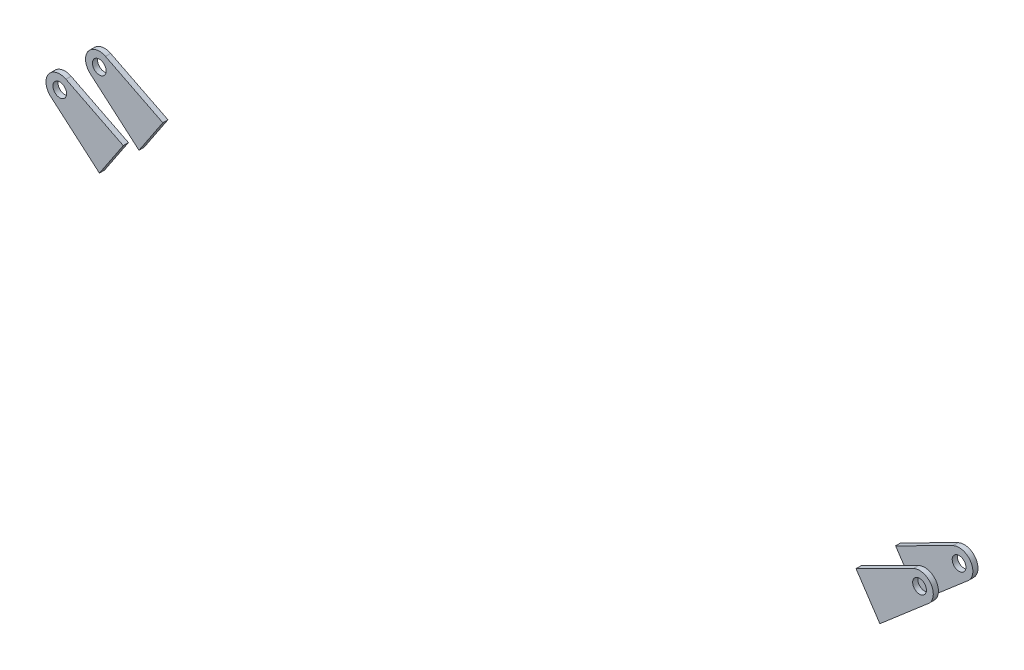
ISO-10303-21;
HEADER;
FILE_DESCRIPTION(('STEP AP214'),'2;1');
FILE_NAME('part.step','',(''),(''),'','','');
FILE_SCHEMA(('AUTOMOTIVE_DESIGN { 1 0 10303 214 1 1 1 1 }'));
ENDSEC;
DATA;
#1=APPLICATION_CONTEXT('core data for automotive mechanical design processes');
#2=APPLICATION_PROTOCOL_DEFINITION('international standard','automotive_design',2000,#1);
#3=PRODUCT_CONTEXT('',#1,'mechanical');
#4=PRODUCT('Part','Part','',(#3));
#5=PRODUCT_RELATED_PRODUCT_CATEGORY('part','',(#4));
#6=PRODUCT_DEFINITION_FORMATION('','',#4);
#7=PRODUCT_DEFINITION_CONTEXT('part definition',#1,'design');
#8=PRODUCT_DEFINITION('design','',#6,#7);
#9=PRODUCT_DEFINITION_SHAPE('','',#8);
#10=(LENGTH_UNIT() NAMED_UNIT(*) SI_UNIT(.MILLI.,.METRE.));
#11=(NAMED_UNIT(*) PLANE_ANGLE_UNIT() SI_UNIT($,.RADIAN.));
#12=(NAMED_UNIT(*) SI_UNIT($,.STERADIAN.) SOLID_ANGLE_UNIT());
#13=UNCERTAINTY_MEASURE_WITH_UNIT(LENGTH_MEASURE(1.E-05),#10,'distance_accuracy_value','');
#14=(GEOMETRIC_REPRESENTATION_CONTEXT(3) GLOBAL_UNCERTAINTY_ASSIGNED_CONTEXT((#13)) GLOBAL_UNIT_ASSIGNED_CONTEXT((#10,
#11,#12)) REPRESENTATION_CONTEXT('',''));
#15=CARTESIAN_POINT('',(0.,0.,0.));
#16=DIRECTION('',(0.,0.,1.));
#17=DIRECTION('',(1.,0.,0.));
#18=AXIS2_PLACEMENT_3D('',#15,#16,#17);
#19=CARTESIAN_POINT('',(0.,0.,119.000000000009));
#20=DIRECTION('',(0.,0.,1.));
#21=DIRECTION('',(1.,0.,0.));
#22=AXIS2_PLACEMENT_3D('',#19,#20,#21);
#23=PLANE('',#22);
#24=CARTESIAN_POINT('',(-250.,-2230.,119.000000000009));
#25=DIRECTION('',(0.,0.,-1.));
#26=DIRECTION('',(-1.,0.,0.));
#27=AXIS2_PLACEMENT_3D('',#24,#25,#26);
#28=CIRCLE('',#27,3.99999999999999);
#29=CARTESIAN_POINT('',(-254.,-2230.,119.000000000009));
#30=VERTEX_POINT('',#29);
#31=EDGE_CURVE('E159',#30,#30,#28,.T.);
#32=ORIENTED_EDGE('',*,*,#31,.F.);
#33=EDGE_LOOP('',(#32));
#34=FACE_BOUND('',#33,.T.);
#35=DIRECTION('',(0.758024269751169,-0.65222634603963,0.));
#36=VECTOR('',#35,1.);
#37=CARTESIAN_POINT('',(-255.217810768318,-2236.06419415801,119.000000000009));
#38=LINE('',#37,#36);
#39=CARTESIAN_POINT('',(-255.217810768317,-2236.06419415801,119.000000000009));
#40=VERTEX_POINT('',#39);
#41=CARTESIAN_POINT('',(-226.933752452818,-2260.40062867922,119.000000000009));
#42=VERTEX_POINT('',#41);
#43=EDGE_CURVE('E157',#40,#42,#38,.T.);
#44=ORIENTED_EDGE('',*,*,#43,.F.);
#45=CARTESIAN_POINT('',(-250.,-2230.,119.000000000009));
#46=DIRECTION('',(0.,0.,-1.));
#47=DIRECTION('',(-1.,0.,0.));
#48=AXIS2_PLACEMENT_3D('',#45,#46,#47);
#49=CIRCLE('',#48,8.0000000000008);
#50=CARTESIAN_POINT('',(-246.409132611189,-2222.85117692232,119.000000000009));
#51=VERTEX_POINT('',#50);
#52=EDGE_CURVE('E146',#40,#51,#49,.T.);
#53=ORIENTED_EDGE('',*,*,#52,.T.);
#54=DIRECTION('',(-0.893602884710091,0.448858423601255,0.));
#55=VECTOR('',#54,1.);
#56=CARTESIAN_POINT('',(-213.066247547185,-2239.59937132078,119.000000000009));
#57=LINE('',#56,#55);
#58=CARTESIAN_POINT('',(-213.066247547185,-2239.59937132078,119.000000000009));
#59=VERTEX_POINT('',#58);
#60=EDGE_CURVE('E138',#59,#51,#57,.T.);
#61=ORIENTED_EDGE('',*,*,#60,.F.);
#62=DIRECTION('',(0.554700196225245,0.832050294337833,0.));
#63=VECTOR('',#62,1.);
#64=CARTESIAN_POINT('',(-226.933752452818,-2260.40062867922,119.000000000009));
#65=LINE('',#64,#63);
#66=EDGE_CURVE('E95',#42,#59,#65,.T.);
#67=ORIENTED_EDGE('',*,*,#66,.F.);
#68=EDGE_LOOP('',(#44,#53,#61,#67));
#69=FACE_BOUND('',#68,.T.);
#70=ADVANCED_FACE('F86',(#34,#69),#23,.F.);
#71=CARTESIAN_POINT('',(0.,0.,122.000000000009));
#72=DIRECTION('',(0.,0.,1.));
#73=DIRECTION('',(1.,0.,0.));
#74=AXIS2_PLACEMENT_3D('',#71,#72,#73);
#75=PLANE('',#74);
#76=CARTESIAN_POINT('',(-250.,-2230.,122.000000000009));
#77=DIRECTION('',(0.,0.,-1.));
#78=DIRECTION('',(-1.,0.,0.));
#79=AXIS2_PLACEMENT_3D('',#76,#77,#78);
#80=CIRCLE('',#79,3.99999999999999);
#81=CARTESIAN_POINT('',(-254.,-2230.,122.000000000009));
#82=VERTEX_POINT('',#81);
#83=EDGE_CURVE('E185',#82,#82,#80,.T.);
#84=ORIENTED_EDGE('',*,*,#83,.T.);
#85=EDGE_LOOP('',(#84));
#86=FACE_BOUND('',#85,.T.);
#87=DIRECTION('',(0.758024269751169,-0.65222634603963,0.));
#88=VECTOR('',#87,1.);
#89=CARTESIAN_POINT('',(-255.217810768318,-2236.06419415801,122.000000000009));
#90=LINE('',#89,#88);
#91=CARTESIAN_POINT('',(-255.217810768317,-2236.06419415801,122.000000000009));
#92=VERTEX_POINT('',#91);
#93=CARTESIAN_POINT('',(-226.933752452818,-2260.40062867922,122.000000000009));
#94=VERTEX_POINT('',#93);
#95=EDGE_CURVE('E173',#92,#94,#90,.T.);
#96=ORIENTED_EDGE('',*,*,#95,.T.);
#97=DIRECTION('',(0.554700196225245,0.832050294337833,0.));
#98=VECTOR('',#97,1.);
#99=CARTESIAN_POINT('',(-226.933752452818,-2260.40062867922,122.000000000009));
#100=LINE('',#99,#98);
#101=CARTESIAN_POINT('',(-213.066247547185,-2239.59937132078,122.000000000009));
#102=VERTEX_POINT('',#101);
#103=EDGE_CURVE('E13',#94,#102,#100,.T.);
#104=ORIENTED_EDGE('',*,*,#103,.T.);
#105=DIRECTION('',(-0.893602884710091,0.448858423601255,0.));
#106=VECTOR('',#105,1.);
#107=CARTESIAN_POINT('',(-213.066247547185,-2239.59937132078,122.000000000009));
#108=LINE('',#107,#106);
#109=CARTESIAN_POINT('',(-246.409132611189,-2222.85117692232,122.000000000009));
#110=VERTEX_POINT('',#109);
#111=EDGE_CURVE('E136',#102,#110,#108,.T.);
#112=ORIENTED_EDGE('',*,*,#111,.T.);
#113=CARTESIAN_POINT('',(-250.,-2230.,122.000000000009));
#114=DIRECTION('',(0.,0.,-1.));
#115=DIRECTION('',(-1.,0.,0.));
#116=AXIS2_PLACEMENT_3D('',#113,#114,#115);
#117=CIRCLE('',#116,8.0000000000008);
#118=EDGE_CURVE('E140',#92,#110,#117,.T.);
#119=ORIENTED_EDGE('',*,*,#118,.F.);
#120=EDGE_LOOP('',(#96,#104,#112,#119));
#121=FACE_BOUND('',#120,.T.);
#122=ADVANCED_FACE('F148',(#86,#121),#75,.T.);
#123=CARTESIAN_POINT('',(-255.217810768318,-2236.06419415801,122.000000000009));
#124=DIRECTION('',(0.65222634603963,0.758024269751169,0.));
#125=DIRECTION('',(0.758024269751169,-0.65222634603963,0.));
#126=AXIS2_PLACEMENT_3D('',#123,#124,#125);
#127=PLANE('',#126);
#128=ORIENTED_EDGE('',*,*,#43,.T.);
#129=DIRECTION('',(0.,0.,-1.));
#130=VECTOR('',#129,1.);
#131=CARTESIAN_POINT('',(-226.933752452818,-2260.40062867922,122.000000000009));
#132=LINE('',#131,#130);
#133=EDGE_CURVE('E104',#94,#42,#132,.T.);
#134=ORIENTED_EDGE('',*,*,#133,.F.);
#135=ORIENTED_EDGE('',*,*,#95,.F.);
#136=DIRECTION('',(0.,0.,-1.));
#137=VECTOR('',#136,1.);
#138=CARTESIAN_POINT('',(-255.217810768317,-2236.06419415801,122.000000000009));
#139=LINE('',#138,#137);
#140=EDGE_CURVE('E120',#92,#40,#139,.T.);
#141=ORIENTED_EDGE('',*,*,#140,.T.);
#142=EDGE_LOOP('',(#128,#134,#135,#141));
#143=FACE_BOUND('',#142,.T.);
#144=ADVANCED_FACE('F199',(#143),#127,.F.);
#145=CARTESIAN_POINT('',(-213.066247547185,-2239.59937132078,122.000000000009));
#146=DIRECTION('',(-0.448858423601255,-0.893602884710091,0.));
#147=DIRECTION('',(-0.893602884710091,0.448858423601255,0.));
#148=AXIS2_PLACEMENT_3D('',#145,#146,#147);
#149=PLANE('',#148);
#150=ORIENTED_EDGE('',*,*,#60,.T.);
#151=DIRECTION('',(0.,0.,-1.));
#152=VECTOR('',#151,1.);
#153=CARTESIAN_POINT('',(-246.409132611189,-2222.85117692232,122.000000000009));
#154=LINE('',#153,#152);
#155=EDGE_CURVE('E127',#110,#51,#154,.T.);
#156=ORIENTED_EDGE('',*,*,#155,.F.);
#157=ORIENTED_EDGE('',*,*,#111,.F.);
#158=DIRECTION('',(0.,0.,-1.));
#159=VECTOR('',#158,1.);
#160=CARTESIAN_POINT('',(-213.066247547185,-2239.59937132078,122.000000000009));
#161=LINE('',#160,#159);
#162=EDGE_CURVE('E133',#102,#59,#161,.T.);
#163=ORIENTED_EDGE('',*,*,#162,.T.);
#164=EDGE_LOOP('',(#150,#156,#157,#163));
#165=FACE_BOUND('',#164,.T.);
#166=ADVANCED_FACE('F134',(#165),#149,.F.);
#167=CARTESIAN_POINT('',(-226.933752452818,-2260.40062867922,122.000000000009));
#168=DIRECTION('',(-0.832050294337833,0.554700196225245,0.));
#169=DIRECTION('',(0.554700196225245,0.832050294337833,0.));
#170=AXIS2_PLACEMENT_3D('',#167,#168,#169);
#171=PLANE('',#170);
#172=ORIENTED_EDGE('',*,*,#66,.T.);
#173=ORIENTED_EDGE('',*,*,#162,.F.);
#174=ORIENTED_EDGE('',*,*,#103,.F.);
#175=ORIENTED_EDGE('',*,*,#133,.T.);
#176=EDGE_LOOP('',(#172,#173,#174,#175));
#177=FACE_BOUND('',#176,.T.);
#178=ADVANCED_FACE('F206',(#177),#171,.F.);
#179=CARTESIAN_POINT('',(-250.,-2230.,122.000000000009));
#180=DIRECTION('',(0.,0.,-1.));
#181=DIRECTION('',(-1.,0.,0.));
#182=AXIS2_PLACEMENT_3D('',#179,#180,#181);
#183=CYLINDRICAL_SURFACE('',#182,8.0000000000008);
#184=ORIENTED_EDGE('',*,*,#52,.F.);
#185=ORIENTED_EDGE('',*,*,#140,.F.);
#186=ORIENTED_EDGE('',*,*,#118,.T.);
#187=ORIENTED_EDGE('',*,*,#155,.T.);
#188=EDGE_LOOP('',(#184,#185,#186,#187));
#189=FACE_BOUND('',#188,.T.);
#190=ADVANCED_FACE('F143',(#189),#183,.T.);
#191=CARTESIAN_POINT('',(-250.,-2230.,122.000000000009));
#192=DIRECTION('',(0.,0.,-1.));
#193=DIRECTION('',(-1.,0.,0.));
#194=AXIS2_PLACEMENT_3D('',#191,#192,#193);
#195=CYLINDRICAL_SURFACE('',#194,3.99999999999999);
#196=ORIENTED_EDGE('',*,*,#83,.F.);
#197=EDGE_LOOP('',(#196));
#198=FACE_BOUND('',#197,.T.);
#199=ORIENTED_EDGE('',*,*,#31,.T.);
#200=EDGE_LOOP('',(#199));
#201=FACE_BOUND('',#200,.T.);
#202=ADVANCED_FACE('F190',(#198,#201),#195,.F.);
#203=CLOSED_SHELL('',(#70,#122,#144,#166,#178,#190,#202));
#204=MANIFOLD_SOLID_BREP('B2',#203);
#205=CARTESIAN_POINT('',(0.,0.,144.999999999998));
#206=DIRECTION('',(0.,0.,-1.));
#207=DIRECTION('',(1.,0.,0.));
#208=AXIS2_PLACEMENT_3D('',#205,#206,#207);
#209=PLANE('',#208);
#210=CARTESIAN_POINT('',(-250.,-2230.,144.999999999998));
#211=DIRECTION('',(0.,0.,-1.));
#212=DIRECTION('',(-1.,0.,0.));
#213=AXIS2_PLACEMENT_3D('',#210,#211,#212);
#214=CIRCLE('',#213,3.99999999999999);
#215=CARTESIAN_POINT('',(-254.,-2230.,144.999999999998));
#216=VERTEX_POINT('',#215);
#217=EDGE_CURVE('E342',#216,#216,#214,.T.);
#218=ORIENTED_EDGE('',*,*,#217,.T.);
#219=EDGE_LOOP('',(#218));
#220=FACE_BOUND('',#219,.T.);
#221=DIRECTION('',(0.758024269751169,-0.65222634603963,0.));
#222=VECTOR('',#221,1.);
#223=CARTESIAN_POINT('',(-255.217810768318,-2236.06419415801,144.999999999998));
#224=LINE('',#223,#222);
#225=CARTESIAN_POINT('',(-255.217810768317,-2236.06419415801,144.999999999998));
#226=VERTEX_POINT('',#225);
#227=CARTESIAN_POINT('',(-226.933752452818,-2260.40062867922,144.999999999998));
#228=VERTEX_POINT('',#227);
#229=EDGE_CURVE('E339',#226,#228,#224,.T.);
#230=ORIENTED_EDGE('',*,*,#229,.T.);
#231=DIRECTION('',(0.554700196225245,0.832050294337833,0.));
#232=VECTOR('',#231,1.);
#233=CARTESIAN_POINT('',(-226.933752452818,-2260.40062867922,144.999999999998));
#234=LINE('',#233,#232);
#235=CARTESIAN_POINT('',(-213.066247547185,-2239.59937132078,144.999999999998));
#236=VERTEX_POINT('',#235);
#237=EDGE_CURVE('E274',#228,#236,#234,.T.);
#238=ORIENTED_EDGE('',*,*,#237,.T.);
#239=DIRECTION('',(-0.893602884710091,0.448858423601255,0.));
#240=VECTOR('',#239,1.);
#241=CARTESIAN_POINT('',(-213.066247547185,-2239.59937132078,144.999999999998));
#242=LINE('',#241,#240);
#243=CARTESIAN_POINT('',(-246.409132611189,-2222.85117692232,144.999999999998));
#244=VERTEX_POINT('',#243);
#245=EDGE_CURVE('E319',#236,#244,#242,.T.);
#246=ORIENTED_EDGE('',*,*,#245,.T.);
#247=CARTESIAN_POINT('',(-250.,-2230.,144.999999999998));
#248=DIRECTION('',(0.,0.,-1.));
#249=DIRECTION('',(-1.,0.,0.));
#250=AXIS2_PLACEMENT_3D('',#247,#248,#249);
#251=CIRCLE('',#250,8.0000000000008);
#252=EDGE_CURVE('E317',#226,#244,#251,.T.);
#253=ORIENTED_EDGE('',*,*,#252,.F.);
#254=EDGE_LOOP('',(#230,#238,#246,#253));
#255=FACE_BOUND('',#254,.T.);
#256=ADVANCED_FACE('F265',(#220,#255),#209,.F.);
#257=CARTESIAN_POINT('',(0.,0.,141.999999999998));
#258=DIRECTION('',(0.,0.,-1.));
#259=DIRECTION('',(1.,0.,0.));
#260=AXIS2_PLACEMENT_3D('',#257,#258,#259);
#261=PLANE('',#260);
#262=CARTESIAN_POINT('',(-250.,-2230.,141.999999999998));
#263=DIRECTION('',(0.,0.,-1.));
#264=DIRECTION('',(-1.,0.,0.));
#265=AXIS2_PLACEMENT_3D('',#262,#263,#264);
#266=CIRCLE('',#265,3.99999999999999);
#267=CARTESIAN_POINT('',(-254.,-2230.,141.999999999998));
#268=VERTEX_POINT('',#267);
#269=EDGE_CURVE('E347',#268,#268,#266,.T.);
#270=ORIENTED_EDGE('',*,*,#269,.F.);
#271=EDGE_LOOP('',(#270));
#272=FACE_BOUND('',#271,.T.);
#273=DIRECTION('',(0.758024269751169,-0.65222634603963,0.));
#274=VECTOR('',#273,1.);
#275=CARTESIAN_POINT('',(-255.217810768318,-2236.06419415801,141.999999999998));
#276=LINE('',#275,#274);
#277=CARTESIAN_POINT('',(-255.217810768317,-2236.06419415801,141.999999999998));
#278=VERTEX_POINT('',#277);
#279=CARTESIAN_POINT('',(-226.933752452818,-2260.40062867922,141.999999999998));
#280=VERTEX_POINT('',#279);
#281=EDGE_CURVE('E327',#278,#280,#276,.T.);
#282=ORIENTED_EDGE('',*,*,#281,.F.);
#283=CARTESIAN_POINT('',(-250.,-2230.,141.999999999998));
#284=DIRECTION('',(0.,0.,-1.));
#285=DIRECTION('',(-1.,0.,0.));
#286=AXIS2_PLACEMENT_3D('',#283,#284,#285);
#287=CIRCLE('',#286,8.0000000000008);
#288=CARTESIAN_POINT('',(-246.409132611189,-2222.85117692232,141.999999999998));
#289=VERTEX_POINT('',#288);
#290=EDGE_CURVE('E315',#278,#289,#287,.T.);
#291=ORIENTED_EDGE('',*,*,#290,.T.);
#292=DIRECTION('',(-0.893602884710091,0.448858423601255,0.));
#293=VECTOR('',#292,1.);
#294=CARTESIAN_POINT('',(-213.066247547185,-2239.59937132078,141.999999999998));
#295=LINE('',#294,#293);
#296=CARTESIAN_POINT('',(-213.066247547185,-2239.59937132078,141.999999999998));
#297=VERTEX_POINT('',#296);
#298=EDGE_CURVE('E322',#297,#289,#295,.T.);
#299=ORIENTED_EDGE('',*,*,#298,.F.);
#300=DIRECTION('',(0.554700196225245,0.832050294337833,0.));
#301=VECTOR('',#300,1.);
#302=CARTESIAN_POINT('',(-226.933752452818,-2260.40062867922,141.999999999998));
#303=LINE('',#302,#301);
#304=EDGE_CURVE('E84',#280,#297,#303,.T.);
#305=ORIENTED_EDGE('',*,*,#304,.F.);
#306=EDGE_LOOP('',(#282,#291,#299,#305));
#307=FACE_BOUND('',#306,.T.);
#308=ADVANCED_FACE('F326',(#272,#307),#261,.T.);
#309=CARTESIAN_POINT('',(-255.217810768318,-2236.06419415801,141.999999999998));
#310=DIRECTION('',(0.65222634603963,0.758024269751169,0.));
#311=DIRECTION('',(0.758024269751169,-0.65222634603963,0.));
#312=AXIS2_PLACEMENT_3D('',#309,#310,#311);
#313=PLANE('',#312);
#314=ORIENTED_EDGE('',*,*,#229,.F.);
#315=DIRECTION('',(0.,0.,1.));
#316=VECTOR('',#315,1.);
#317=CARTESIAN_POINT('',(-255.217810768317,-2236.06419415801,141.999999999998));
#318=LINE('',#317,#316);
#319=EDGE_CURVE('E301',#278,#226,#318,.T.);
#320=ORIENTED_EDGE('',*,*,#319,.F.);
#321=ORIENTED_EDGE('',*,*,#281,.T.);
#322=DIRECTION('',(0.,0.,1.));
#323=VECTOR('',#322,1.);
#324=CARTESIAN_POINT('',(-226.933752452818,-2260.40062867922,141.999999999998));
#325=LINE('',#324,#323);
#326=EDGE_CURVE('E282',#280,#228,#325,.T.);
#327=ORIENTED_EDGE('',*,*,#326,.T.);
#328=EDGE_LOOP('',(#314,#320,#321,#327));
#329=FACE_BOUND('',#328,.T.);
#330=ADVANCED_FACE('F374',(#329),#313,.F.);
#331=CARTESIAN_POINT('',(-213.066247547185,-2239.59937132078,141.999999999998));
#332=DIRECTION('',(-0.448858423601255,-0.893602884710091,0.));
#333=DIRECTION('',(-0.893602884710091,0.448858423601255,0.));
#334=AXIS2_PLACEMENT_3D('',#331,#332,#333);
#335=PLANE('',#334);
#336=ORIENTED_EDGE('',*,*,#245,.F.);
#337=DIRECTION('',(0.,0.,1.));
#338=VECTOR('',#337,1.);
#339=CARTESIAN_POINT('',(-213.066247547185,-2239.59937132078,141.999999999998));
#340=LINE('',#339,#338);
#341=EDGE_CURVE('E312',#297,#236,#340,.T.);
#342=ORIENTED_EDGE('',*,*,#341,.F.);
#343=ORIENTED_EDGE('',*,*,#298,.T.);
#344=DIRECTION('',(0.,0.,1.));
#345=VECTOR('',#344,1.);
#346=CARTESIAN_POINT('',(-246.409132611189,-2222.85117692232,141.999999999998));
#347=LINE('',#346,#345);
#348=EDGE_CURVE('E309',#289,#244,#347,.T.);
#349=ORIENTED_EDGE('',*,*,#348,.T.);
#350=EDGE_LOOP('',(#336,#342,#343,#349));
#351=FACE_BOUND('',#350,.T.);
#352=ADVANCED_FACE('F323',(#351),#335,.F.);
#353=CARTESIAN_POINT('',(-226.933752452818,-2260.40062867922,141.999999999998));
#354=DIRECTION('',(-0.832050294337833,0.554700196225245,0.));
#355=DIRECTION('',(0.554700196225245,0.832050294337833,0.));
#356=AXIS2_PLACEMENT_3D('',#353,#354,#355);
#357=PLANE('',#356);
#358=ORIENTED_EDGE('',*,*,#237,.F.);
#359=ORIENTED_EDGE('',*,*,#326,.F.);
#360=ORIENTED_EDGE('',*,*,#304,.T.);
#361=ORIENTED_EDGE('',*,*,#341,.T.);
#362=EDGE_LOOP('',(#358,#359,#360,#361));
#363=FACE_BOUND('',#362,.T.);
#364=ADVANCED_FACE('F382',(#363),#357,.F.);
#365=CARTESIAN_POINT('',(-250.,-2230.,141.999999999998));
#366=DIRECTION('',(0.,0.,1.));
#367=DIRECTION('',(-1.,0.,0.));
#368=AXIS2_PLACEMENT_3D('',#365,#366,#367);
#369=CYLINDRICAL_SURFACE('',#368,8.0000000000008);
#370=ORIENTED_EDGE('',*,*,#252,.T.);
#371=ORIENTED_EDGE('',*,*,#348,.F.);
#372=ORIENTED_EDGE('',*,*,#290,.F.);
#373=ORIENTED_EDGE('',*,*,#319,.T.);
#374=EDGE_LOOP('',(#370,#371,#372,#373));
#375=FACE_BOUND('',#374,.T.);
#376=ADVANCED_FACE('F313',(#375),#369,.T.);
#377=CARTESIAN_POINT('',(-250.,-2230.,141.999999999998));
#378=DIRECTION('',(0.,0.,1.));
#379=DIRECTION('',(-1.,0.,0.));
#380=AXIS2_PLACEMENT_3D('',#377,#378,#379);
#381=CYLINDRICAL_SURFACE('',#380,3.99999999999999);
#382=ORIENTED_EDGE('',*,*,#269,.T.);
#383=EDGE_LOOP('',(#382));
#384=FACE_BOUND('',#383,.T.);
#385=ORIENTED_EDGE('',*,*,#217,.F.);
#386=EDGE_LOOP('',(#385));
#387=FACE_BOUND('',#386,.T.);
#388=ADVANCED_FACE('F370',(#384,#387),#381,.F.);
#389=CLOSED_SHELL('',(#256,#308,#330,#352,#364,#376,#388));
#390=MANIFOLD_SOLID_BREP('B7',#389);
#391=CARTESIAN_POINT('',(0.,0.,119.000000000009));
#392=DIRECTION('',(0.,0.,1.));
#393=DIRECTION('',(-1.,0.,0.));
#394=AXIS2_PLACEMENT_3D('',#391,#392,#393);
#395=PLANE('',#394);
#396=CARTESIAN_POINT('',(250.,-2230.,119.000000000009));
#397=DIRECTION('',(0.,0.,1.));
#398=DIRECTION('',(1.,0.,0.));
#399=AXIS2_PLACEMENT_3D('',#396,#397,#398);
#400=CIRCLE('',#399,3.99999999999999);
#401=CARTESIAN_POINT('',(254.,-2230.,119.000000000009));
#402=VERTEX_POINT('',#401);
#403=EDGE_CURVE('E520',#402,#402,#400,.T.);
#404=ORIENTED_EDGE('',*,*,#403,.T.);
#405=EDGE_LOOP('',(#404));
#406=FACE_BOUND('',#405,.T.);
#407=DIRECTION('',(-0.758024269751169,-0.65222634603963,0.));
#408=VECTOR('',#407,1.);
#409=CARTESIAN_POINT('',(255.217810768318,-2236.06419415801,119.000000000009));
#410=LINE('',#409,#408);
#411=CARTESIAN_POINT('',(255.217810768317,-2236.06419415801,119.000000000009));
#412=VERTEX_POINT('',#411);
#413=CARTESIAN_POINT('',(226.933752452818,-2260.40062867922,119.000000000009));
#414=VERTEX_POINT('',#413);
#415=EDGE_CURVE('E517',#412,#414,#410,.T.);
#416=ORIENTED_EDGE('',*,*,#415,.T.);
#417=DIRECTION('',(-0.554700196225245,0.832050294337833,0.));
#418=VECTOR('',#417,1.);
#419=CARTESIAN_POINT('',(226.933752452818,-2260.40062867922,119.000000000009));
#420=LINE('',#419,#418);
#421=CARTESIAN_POINT('',(213.066247547185,-2239.59937132078,119.000000000009));
#422=VERTEX_POINT('',#421);
#423=EDGE_CURVE('E452',#414,#422,#420,.T.);
#424=ORIENTED_EDGE('',*,*,#423,.T.);
#425=DIRECTION('',(0.893602884710091,0.448858423601255,0.));
#426=VECTOR('',#425,1.);
#427=CARTESIAN_POINT('',(213.066247547185,-2239.59937132078,119.000000000009));
#428=LINE('',#427,#426);
#429=CARTESIAN_POINT('',(246.409132611189,-2222.85117692232,119.000000000009));
#430=VERTEX_POINT('',#429);
#431=EDGE_CURVE('E497',#422,#430,#428,.T.);
#432=ORIENTED_EDGE('',*,*,#431,.T.);
#433=CARTESIAN_POINT('',(250.,-2230.,119.000000000009));
#434=DIRECTION('',(0.,0.,1.));
#435=DIRECTION('',(1.,0.,0.));
#436=AXIS2_PLACEMENT_3D('',#433,#434,#435);
#437=CIRCLE('',#436,8.0000000000008);
#438=EDGE_CURVE('E495',#412,#430,#437,.T.);
#439=ORIENTED_EDGE('',*,*,#438,.F.);
#440=EDGE_LOOP('',(#416,#424,#432,#439));
#441=FACE_BOUND('',#440,.T.);
#442=ADVANCED_FACE('F443',(#406,#441),#395,.F.);
#443=CARTESIAN_POINT('',(0.,0.,122.000000000009));
#444=DIRECTION('',(0.,0.,1.));
#445=DIRECTION('',(-1.,0.,0.));
#446=AXIS2_PLACEMENT_3D('',#443,#444,#445);
#447=PLANE('',#446);
#448=CARTESIAN_POINT('',(250.,-2230.,122.000000000009));
#449=DIRECTION('',(0.,0.,1.));
#450=DIRECTION('',(1.,0.,0.));
#451=AXIS2_PLACEMENT_3D('',#448,#449,#450);
#452=CIRCLE('',#451,3.99999999999999);
#453=CARTESIAN_POINT('',(254.,-2230.,122.000000000009));
#454=VERTEX_POINT('',#453);
#455=EDGE_CURVE('E525',#454,#454,#452,.T.);
#456=ORIENTED_EDGE('',*,*,#455,.F.);
#457=EDGE_LOOP('',(#456));
#458=FACE_BOUND('',#457,.T.);
#459=DIRECTION('',(-0.758024269751169,-0.65222634603963,0.));
#460=VECTOR('',#459,1.);
#461=CARTESIAN_POINT('',(255.217810768318,-2236.06419415801,122.000000000009));
#462=LINE('',#461,#460);
#463=CARTESIAN_POINT('',(255.217810768317,-2236.06419415801,122.000000000009));
#464=VERTEX_POINT('',#463);
#465=CARTESIAN_POINT('',(226.933752452818,-2260.40062867922,122.000000000009));
#466=VERTEX_POINT('',#465);
#467=EDGE_CURVE('E505',#464,#466,#462,.T.);
#468=ORIENTED_EDGE('',*,*,#467,.F.);
#469=CARTESIAN_POINT('',(250.,-2230.,122.000000000009));
#470=DIRECTION('',(0.,0.,1.));
#471=DIRECTION('',(1.,0.,0.));
#472=AXIS2_PLACEMENT_3D('',#469,#470,#471);
#473=CIRCLE('',#472,8.0000000000008);
#474=CARTESIAN_POINT('',(246.409132611189,-2222.85117692232,122.000000000009));
#475=VERTEX_POINT('',#474);
#476=EDGE_CURVE('E493',#464,#475,#473,.T.);
#477=ORIENTED_EDGE('',*,*,#476,.T.);
#478=DIRECTION('',(0.893602884710091,0.448858423601255,0.));
#479=VECTOR('',#478,1.);
#480=CARTESIAN_POINT('',(213.066247547185,-2239.59937132078,122.000000000009));
#481=LINE('',#480,#479);
#482=CARTESIAN_POINT('',(213.066247547185,-2239.59937132078,122.000000000009));
#483=VERTEX_POINT('',#482);
#484=EDGE_CURVE('E500',#483,#475,#481,.T.);
#485=ORIENTED_EDGE('',*,*,#484,.F.);
#486=DIRECTION('',(-0.554700196225245,0.832050294337833,0.));
#487=VECTOR('',#486,1.);
#488=CARTESIAN_POINT('',(226.933752452818,-2260.40062867922,122.000000000009));
#489=LINE('',#488,#487);
#490=EDGE_CURVE('E263',#466,#483,#489,.T.);
#491=ORIENTED_EDGE('',*,*,#490,.F.);
#492=EDGE_LOOP('',(#468,#477,#485,#491));
#493=FACE_BOUND('',#492,.T.);
#494=ADVANCED_FACE('F504',(#458,#493),#447,.T.);
#495=CARTESIAN_POINT('',(255.217810768318,-2236.06419415801,122.000000000009));
#496=DIRECTION('',(-0.65222634603963,0.758024269751169,0.));
#497=DIRECTION('',(-0.758024269751169,-0.65222634603963,0.));
#498=AXIS2_PLACEMENT_3D('',#495,#496,#497);
#499=PLANE('',#498);
#500=ORIENTED_EDGE('',*,*,#415,.F.);
#501=DIRECTION('',(0.,0.,-1.));
#502=VECTOR('',#501,1.);
#503=CARTESIAN_POINT('',(255.217810768317,-2236.06419415801,122.000000000009));
#504=LINE('',#503,#502);
#505=EDGE_CURVE('E479',#464,#412,#504,.T.);
#506=ORIENTED_EDGE('',*,*,#505,.F.);
#507=ORIENTED_EDGE('',*,*,#467,.T.);
#508=DIRECTION('',(0.,0.,-1.));
#509=VECTOR('',#508,1.);
#510=CARTESIAN_POINT('',(226.933752452818,-2260.40062867922,122.000000000009));
#511=LINE('',#510,#509);
#512=EDGE_CURVE('E460',#466,#414,#511,.T.);
#513=ORIENTED_EDGE('',*,*,#512,.T.);
#514=EDGE_LOOP('',(#500,#506,#507,#513));
#515=FACE_BOUND('',#514,.T.);
#516=ADVANCED_FACE('F552',(#515),#499,.F.);
#517=CARTESIAN_POINT('',(213.066247547185,-2239.59937132078,122.000000000009));
#518=DIRECTION('',(0.448858423601255,-0.893602884710091,0.));
#519=DIRECTION('',(0.893602884710091,0.448858423601255,0.));
#520=AXIS2_PLACEMENT_3D('',#517,#518,#519);
#521=PLANE('',#520);
#522=ORIENTED_EDGE('',*,*,#431,.F.);
#523=DIRECTION('',(0.,0.,-1.));
#524=VECTOR('',#523,1.);
#525=CARTESIAN_POINT('',(213.066247547185,-2239.59937132078,122.000000000009));
#526=LINE('',#525,#524);
#527=EDGE_CURVE('E490',#483,#422,#526,.T.);
#528=ORIENTED_EDGE('',*,*,#527,.F.);
#529=ORIENTED_EDGE('',*,*,#484,.T.);
#530=DIRECTION('',(0.,0.,-1.));
#531=VECTOR('',#530,1.);
#532=CARTESIAN_POINT('',(246.409132611189,-2222.85117692232,122.000000000009));
#533=LINE('',#532,#531);
#534=EDGE_CURVE('E487',#475,#430,#533,.T.);
#535=ORIENTED_EDGE('',*,*,#534,.T.);
#536=EDGE_LOOP('',(#522,#528,#529,#535));
#537=FACE_BOUND('',#536,.T.);
#538=ADVANCED_FACE('F501',(#537),#521,.F.);
#539=CARTESIAN_POINT('',(226.933752452818,-2260.40062867922,122.000000000009));
#540=DIRECTION('',(0.832050294337833,0.554700196225245,0.));
#541=DIRECTION('',(-0.554700196225245,0.832050294337833,0.));
#542=AXIS2_PLACEMENT_3D('',#539,#540,#541);
#543=PLANE('',#542);
#544=ORIENTED_EDGE('',*,*,#423,.F.);
#545=ORIENTED_EDGE('',*,*,#512,.F.);
#546=ORIENTED_EDGE('',*,*,#490,.T.);
#547=ORIENTED_EDGE('',*,*,#527,.T.);
#548=EDGE_LOOP('',(#544,#545,#546,#547));
#549=FACE_BOUND('',#548,.T.);
#550=ADVANCED_FACE('F560',(#549),#543,.F.);
#551=CARTESIAN_POINT('',(250.,-2230.,122.000000000009));
#552=DIRECTION('',(0.,0.,-1.));
#553=DIRECTION('',(1.,0.,0.));
#554=AXIS2_PLACEMENT_3D('',#551,#552,#553);
#555=CYLINDRICAL_SURFACE('',#554,8.0000000000008);
#556=ORIENTED_EDGE('',*,*,#438,.T.);
#557=ORIENTED_EDGE('',*,*,#534,.F.);
#558=ORIENTED_EDGE('',*,*,#476,.F.);
#559=ORIENTED_EDGE('',*,*,#505,.T.);
#560=EDGE_LOOP('',(#556,#557,#558,#559));
#561=FACE_BOUND('',#560,.T.);
#562=ADVANCED_FACE('F491',(#561),#555,.T.);
#563=CARTESIAN_POINT('',(250.,-2230.,122.000000000009));
#564=DIRECTION('',(0.,0.,-1.));
#565=DIRECTION('',(1.,0.,0.));
#566=AXIS2_PLACEMENT_3D('',#563,#564,#565);
#567=CYLINDRICAL_SURFACE('',#566,3.99999999999999);
#568=ORIENTED_EDGE('',*,*,#455,.T.);
#569=EDGE_LOOP('',(#568));
#570=FACE_BOUND('',#569,.T.);
#571=ORIENTED_EDGE('',*,*,#403,.F.);
#572=EDGE_LOOP('',(#571));
#573=FACE_BOUND('',#572,.T.);
#574=ADVANCED_FACE('F548',(#570,#573),#567,.F.);
#575=CLOSED_SHELL('',(#442,#494,#516,#538,#550,#562,#574));
#576=MANIFOLD_SOLID_BREP('B78',#575);
#577=CARTESIAN_POINT('',(0.,0.,144.999999999998));
#578=DIRECTION('',(0.,0.,-1.));
#579=DIRECTION('',(-1.,0.,0.));
#580=AXIS2_PLACEMENT_3D('',#577,#578,#579);
#581=PLANE('',#580);
#582=CARTESIAN_POINT('',(250.,-2230.,144.999999999998));
#583=DIRECTION('',(0.,0.,1.));
#584=DIRECTION('',(1.,0.,0.));
#585=AXIS2_PLACEMENT_3D('',#582,#583,#584);
#586=CIRCLE('',#585,3.99999999999999);
#587=CARTESIAN_POINT('',(254.,-2230.,144.999999999998));
#588=VERTEX_POINT('',#587);
#589=EDGE_CURVE('E685',#588,#588,#586,.T.);
#590=ORIENTED_EDGE('',*,*,#589,.F.);
#591=EDGE_LOOP('',(#590));
#592=FACE_BOUND('',#591,.T.);
#593=DIRECTION('',(-0.758024269751169,-0.65222634603963,0.));
#594=VECTOR('',#593,1.);
#595=CARTESIAN_POINT('',(255.217810768318,-2236.06419415801,144.999999999998));
#596=LINE('',#595,#594);
#597=CARTESIAN_POINT('',(255.217810768317,-2236.06419415801,144.999999999998));
#598=VERTEX_POINT('',#597);
#599=CARTESIAN_POINT('',(226.933752452818,-2260.40062867922,144.999999999998));
#600=VERTEX_POINT('',#599);
#601=EDGE_CURVE('E642',#598,#600,#596,.T.);
#602=ORIENTED_EDGE('',*,*,#601,.F.);
#603=CARTESIAN_POINT('',(250.,-2230.,144.999999999998));
#604=DIRECTION('',(0.,0.,1.));
#605=DIRECTION('',(1.,0.,0.));
#606=AXIS2_PLACEMENT_3D('',#603,#604,#605);
#607=CIRCLE('',#606,8.0000000000008);
#608=CARTESIAN_POINT('',(246.409132611189,-2222.85117692232,144.999999999998));
#609=VERTEX_POINT('',#608);
#610=EDGE_CURVE('E650',#598,#609,#607,.T.);
#611=ORIENTED_EDGE('',*,*,#610,.T.);
#612=DIRECTION('',(0.893602884710091,0.448858423601255,0.));
#613=VECTOR('',#612,1.);
#614=CARTESIAN_POINT('',(213.066247547185,-2239.59937132078,144.999999999998));
#615=LINE('',#614,#613);
#616=CARTESIAN_POINT('',(213.066247547185,-2239.59937132078,144.999999999998));
#617=VERTEX_POINT('',#616);
#618=EDGE_CURVE('E657',#617,#609,#615,.T.);
#619=ORIENTED_EDGE('',*,*,#618,.F.);
#620=DIRECTION('',(-0.554700196225245,0.832050294337833,0.));
#621=VECTOR('',#620,1.);
#622=CARTESIAN_POINT('',(226.933752452818,-2260.40062867922,144.999999999998));
#623=LINE('',#622,#621);
#624=EDGE_CURVE('E621',#600,#617,#623,.T.);
#625=ORIENTED_EDGE('',*,*,#624,.F.);
#626=EDGE_LOOP('',(#602,#611,#619,#625));
#627=FACE_BOUND('',#626,.T.);
#628=ADVANCED_FACE('F612',(#592,#627),#581,.F.);
#629=CARTESIAN_POINT('',(0.,0.,141.999999999998));
#630=DIRECTION('',(0.,0.,-1.));
#631=DIRECTION('',(-1.,0.,0.));
#632=AXIS2_PLACEMENT_3D('',#629,#630,#631);
#633=PLANE('',#632);
#634=CARTESIAN_POINT('',(250.,-2230.,141.999999999998));
#635=DIRECTION('',(0.,0.,1.));
#636=DIRECTION('',(1.,0.,0.));
#637=AXIS2_PLACEMENT_3D('',#634,#635,#636);
#638=CIRCLE('',#637,3.99999999999999);
#639=CARTESIAN_POINT('',(254.,-2230.,141.999999999998));
#640=VERTEX_POINT('',#639);
#641=EDGE_CURVE('E712',#640,#640,#638,.T.);
#642=ORIENTED_EDGE('',*,*,#641,.T.);
#643=EDGE_LOOP('',(#642));
#644=FACE_BOUND('',#643,.T.);
#645=DIRECTION('',(-0.758024269751169,-0.65222634603963,0.));
#646=VECTOR('',#645,1.);
#647=CARTESIAN_POINT('',(255.217810768318,-2236.06419415801,141.999999999998));
#648=LINE('',#647,#646);
#649=CARTESIAN_POINT('',(255.217810768317,-2236.06419415801,141.999999999998));
#650=VERTEX_POINT('',#649);
#651=CARTESIAN_POINT('',(226.933752452818,-2260.40062867922,141.999999999998));
#652=VERTEX_POINT('',#651);
#653=EDGE_CURVE('E700',#650,#652,#648,.T.);
#654=ORIENTED_EDGE('',*,*,#653,.T.);
#655=DIRECTION('',(-0.554700196225245,0.832050294337833,0.));
#656=VECTOR('',#655,1.);
#657=CARTESIAN_POINT('',(226.933752452818,-2260.40062867922,141.999999999998));
#658=LINE('',#657,#656);
#659=CARTESIAN_POINT('',(213.066247547185,-2239.59937132078,141.999999999998));
#660=VERTEX_POINT('',#659);
#661=EDGE_CURVE('E441',#652,#660,#658,.T.);
#662=ORIENTED_EDGE('',*,*,#661,.T.);
#663=DIRECTION('',(0.893602884710091,0.448858423601255,0.));
#664=VECTOR('',#663,1.);
#665=CARTESIAN_POINT('',(213.066247547185,-2239.59937132078,141.999999999998));
#666=LINE('',#665,#664);
#667=CARTESIAN_POINT('',(246.409132611189,-2222.85117692232,141.999999999998));
#668=VERTEX_POINT('',#667);
#669=EDGE_CURVE('E672',#660,#668,#666,.T.);
#670=ORIENTED_EDGE('',*,*,#669,.T.);
#671=CARTESIAN_POINT('',(250.,-2230.,141.999999999998));
#672=DIRECTION('',(0.,0.,1.));
#673=DIRECTION('',(1.,0.,0.));
#674=AXIS2_PLACEMENT_3D('',#671,#672,#673);
#675=CIRCLE('',#674,8.0000000000008);
#676=EDGE_CURVE('E663',#650,#668,#675,.T.);
#677=ORIENTED_EDGE('',*,*,#676,.F.);
#678=EDGE_LOOP('',(#654,#662,#670,#677));
#679=FACE_BOUND('',#678,.T.);
#680=ADVANCED_FACE('F674',(#644,#679),#633,.T.);
#681=CARTESIAN_POINT('',(255.217810768318,-2236.06419415801,141.999999999998));
#682=DIRECTION('',(-0.65222634603963,0.758024269751169,0.));
#683=DIRECTION('',(-0.758024269751169,-0.65222634603963,0.));
#684=AXIS2_PLACEMENT_3D('',#681,#682,#683);
#685=PLANE('',#684);
#686=ORIENTED_EDGE('',*,*,#601,.T.);
#687=DIRECTION('',(0.,0.,1.));
#688=VECTOR('',#687,1.);
#689=CARTESIAN_POINT('',(226.933752452818,-2260.40062867922,141.999999999998));
#690=LINE('',#689,#688);
#691=EDGE_CURVE('E698',#652,#600,#690,.T.);
#692=ORIENTED_EDGE('',*,*,#691,.F.);
#693=ORIENTED_EDGE('',*,*,#653,.F.);
#694=DIRECTION('',(0.,0.,1.));
#695=VECTOR('',#694,1.);
#696=CARTESIAN_POINT('',(255.217810768317,-2236.06419415801,141.999999999998));
#697=LINE('',#696,#695);
#698=EDGE_CURVE('E666',#650,#598,#697,.T.);
#699=ORIENTED_EDGE('',*,*,#698,.T.);
#700=EDGE_LOOP('',(#686,#692,#693,#699));
#701=FACE_BOUND('',#700,.T.);
#702=ADVANCED_FACE('F728',(#701),#685,.F.);
#703=CARTESIAN_POINT('',(213.066247547185,-2239.59937132078,141.999999999998));
#704=DIRECTION('',(0.448858423601255,-0.893602884710091,0.));
#705=DIRECTION('',(0.893602884710091,0.448858423601255,0.));
#706=AXIS2_PLACEMENT_3D('',#703,#704,#705);
#707=PLANE('',#706);
#708=ORIENTED_EDGE('',*,*,#618,.T.);
#709=DIRECTION('',(0.,0.,1.));
#710=VECTOR('',#709,1.);
#711=CARTESIAN_POINT('',(246.409132611189,-2222.85117692232,141.999999999998));
#712=LINE('',#711,#710);
#713=EDGE_CURVE('E665',#668,#609,#712,.T.);
#714=ORIENTED_EDGE('',*,*,#713,.F.);
#715=ORIENTED_EDGE('',*,*,#669,.F.);
#716=DIRECTION('',(0.,0.,1.));
#717=VECTOR('',#716,1.);
#718=CARTESIAN_POINT('',(213.066247547185,-2239.59937132078,141.999999999998));
#719=LINE('',#718,#717);
#720=EDGE_CURVE('E675',#660,#617,#719,.T.);
#721=ORIENTED_EDGE('',*,*,#720,.T.);
#722=EDGE_LOOP('',(#708,#714,#715,#721));
#723=FACE_BOUND('',#722,.T.);
#724=ADVANCED_FACE('F671',(#723),#707,.F.);
#725=CARTESIAN_POINT('',(226.933752452818,-2260.40062867922,141.999999999998));
#726=DIRECTION('',(0.832050294337833,0.554700196225245,0.));
#727=DIRECTION('',(-0.554700196225245,0.832050294337833,0.));
#728=AXIS2_PLACEMENT_3D('',#725,#726,#727);
#729=PLANE('',#728);
#730=ORIENTED_EDGE('',*,*,#624,.T.);
#731=ORIENTED_EDGE('',*,*,#720,.F.);
#732=ORIENTED_EDGE('',*,*,#661,.F.);
#733=ORIENTED_EDGE('',*,*,#691,.T.);
#734=EDGE_LOOP('',(#730,#731,#732,#733));
#735=FACE_BOUND('',#734,.T.);
#736=ADVANCED_FACE('F730',(#735),#729,.F.);
#737=CARTESIAN_POINT('',(250.,-2230.,141.999999999998));
#738=DIRECTION('',(0.,0.,1.));
#739=DIRECTION('',(1.,0.,0.));
#740=AXIS2_PLACEMENT_3D('',#737,#738,#739);
#741=CYLINDRICAL_SURFACE('',#740,8.0000000000008);
#742=ORIENTED_EDGE('',*,*,#610,.F.);
#743=ORIENTED_EDGE('',*,*,#698,.F.);
#744=ORIENTED_EDGE('',*,*,#676,.T.);
#745=ORIENTED_EDGE('',*,*,#713,.T.);
#746=EDGE_LOOP('',(#742,#743,#744,#745));
#747=FACE_BOUND('',#746,.T.);
#748=ADVANCED_FACE('F664',(#747),#741,.T.);
#749=CARTESIAN_POINT('',(250.,-2230.,141.999999999998));
#750=DIRECTION('',(0.,0.,1.));
#751=DIRECTION('',(1.,0.,0.));
#752=AXIS2_PLACEMENT_3D('',#749,#750,#751);
#753=CYLINDRICAL_SURFACE('',#752,3.99999999999999);
#754=ORIENTED_EDGE('',*,*,#641,.F.);
#755=EDGE_LOOP('',(#754));
#756=FACE_BOUND('',#755,.T.);
#757=ORIENTED_EDGE('',*,*,#589,.T.);
#758=EDGE_LOOP('',(#757));
#759=FACE_BOUND('',#758,.T.);
#760=ADVANCED_FACE('F717',(#756,#759),#753,.F.);
#761=CLOSED_SHELL('',(#628,#680,#702,#724,#736,#748,#760));
#762=MANIFOLD_SOLID_BREP('B257',#761);
#763=ADVANCED_BREP_SHAPE_REPRESENTATION('',(#18,#204,#390,#576,#762),#14);
#764=SHAPE_DEFINITION_REPRESENTATION(#9,#763);
ENDSEC;
END-ISO-10303-21;
